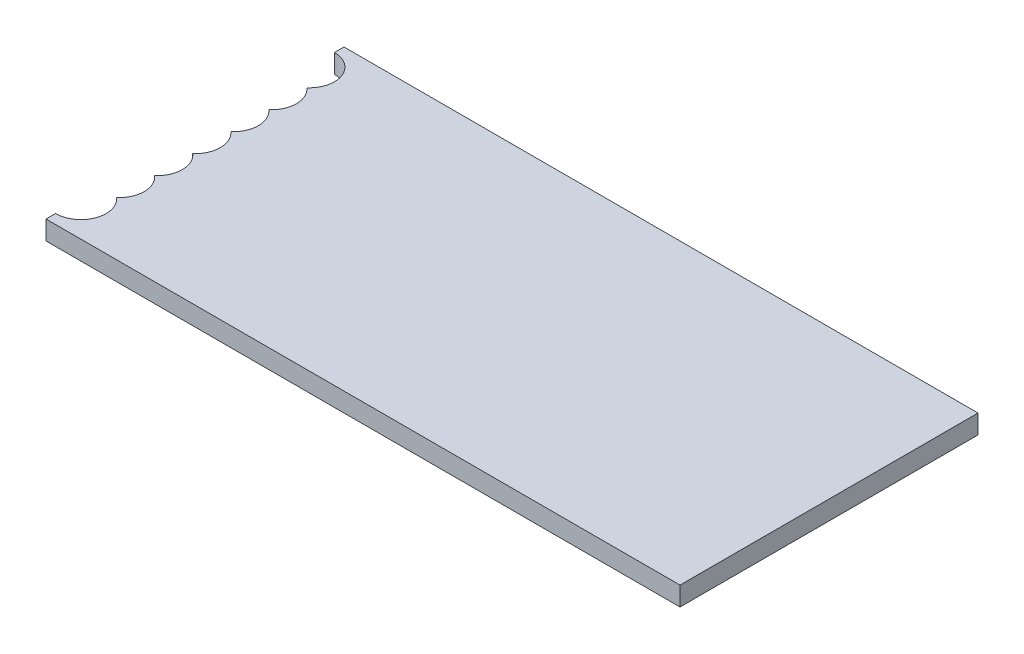
ISO-10303-21;
HEADER;
FILE_DESCRIPTION(('STEP AP214'),'2;1');
FILE_NAME('part.step','',(''),(''),'','','');
FILE_SCHEMA(('AUTOMOTIVE_DESIGN { 1 0 10303 214 1 1 1 1 }'));
ENDSEC;
DATA;
#1=APPLICATION_CONTEXT('core data for automotive mechanical design processes');
#2=APPLICATION_PROTOCOL_DEFINITION('international standard','automotive_design',2000,#1);
#3=PRODUCT_CONTEXT('',#1,'mechanical');
#4=PRODUCT('Part','Part','',(#3));
#5=PRODUCT_RELATED_PRODUCT_CATEGORY('part','',(#4));
#6=PRODUCT_DEFINITION_FORMATION('','',#4);
#7=PRODUCT_DEFINITION_CONTEXT('part definition',#1,'design');
#8=PRODUCT_DEFINITION('design','',#6,#7);
#9=PRODUCT_DEFINITION_SHAPE('','',#8);
#10=(LENGTH_UNIT() NAMED_UNIT(*) SI_UNIT(.MILLI.,.METRE.));
#11=(NAMED_UNIT(*) PLANE_ANGLE_UNIT() SI_UNIT($,.RADIAN.));
#12=(NAMED_UNIT(*) SI_UNIT($,.STERADIAN.) SOLID_ANGLE_UNIT());
#13=UNCERTAINTY_MEASURE_WITH_UNIT(LENGTH_MEASURE(1.E-05),#10,'distance_accuracy_value','');
#14=(GEOMETRIC_REPRESENTATION_CONTEXT(3) GLOBAL_UNCERTAINTY_ASSIGNED_CONTEXT((#13)) GLOBAL_UNIT_ASSIGNED_CONTEXT((#10,
#11,#12)) REPRESENTATION_CONTEXT('',''));
#15=CARTESIAN_POINT('',(0.,0.,0.));
#16=DIRECTION('',(0.,0.,1.));
#17=DIRECTION('',(1.,0.,0.));
#18=AXIS2_PLACEMENT_3D('',#15,#16,#17);
#19=CARTESIAN_POINT('',(-25.,1.5,11.75));
#20=DIRECTION('',(1.,0.,0.));
#21=DIRECTION('',(0.,0.,-1.));
#22=AXIS2_PLACEMENT_3D('',#19,#20,#21);
#23=PLANE('',#22);
#24=DIRECTION('',(0.,0.,1.));
#25=VECTOR('',#24,1.);
#26=CARTESIAN_POINT('',(-25.,0.,11.75));
#27=LINE('',#26,#25);
#28=CARTESIAN_POINT('',(-25.,0.,-11.75));
#29=VERTEX_POINT('',#28);
#30=CARTESIAN_POINT('',(-25.,0.,-11.));
#31=VERTEX_POINT('',#30);
#32=EDGE_CURVE('E159',#29,#31,#27,.T.);
#33=ORIENTED_EDGE('',*,*,#32,.T.);
#34=DIRECTION('',(0.,1.,0.));
#35=VECTOR('',#34,1.);
#36=CARTESIAN_POINT('',(-25.,0.,-11.));
#37=LINE('',#36,#35);
#38=CARTESIAN_POINT('',(-25.,1.5,-11.));
#39=VERTEX_POINT('',#38);
#40=EDGE_CURVE('E208',#31,#39,#37,.T.);
#41=ORIENTED_EDGE('',*,*,#40,.T.);
#42=DIRECTION('',(0.,0.,1.));
#43=VECTOR('',#42,1.);
#44=CARTESIAN_POINT('',(-25.,1.5,11.75));
#45=LINE('',#44,#43);
#46=CARTESIAN_POINT('',(-25.,1.5,-11.75));
#47=VERTEX_POINT('',#46);
#48=EDGE_CURVE('E178',#47,#39,#45,.T.);
#49=ORIENTED_EDGE('',*,*,#48,.F.);
#50=DIRECTION('',(0.,-1.,0.));
#51=VECTOR('',#50,1.);
#52=CARTESIAN_POINT('',(-25.,1.5,-11.75));
#53=LINE('',#52,#51);
#54=EDGE_CURVE('E48',#47,#29,#53,.T.);
#55=ORIENTED_EDGE('',*,*,#54,.T.);
#56=EDGE_LOOP('',(#33,#41,#49,#55));
#57=FACE_BOUND('',#56,.T.);
#58=ADVANCED_FACE('F40',(#57),#23,.F.);
#59=CARTESIAN_POINT('',(25.,1.5,11.75));
#60=DIRECTION('',(-1.,0.,0.));
#61=DIRECTION('',(0.,0.,1.));
#62=AXIS2_PLACEMENT_3D('',#59,#60,#61);
#63=PLANE('',#62);
#64=DIRECTION('',(0.,0.,-1.));
#65=VECTOR('',#64,1.);
#66=CARTESIAN_POINT('',(25.,0.,11.75));
#67=LINE('',#66,#65);
#68=CARTESIAN_POINT('',(25.,0.,11.75));
#69=VERTEX_POINT('',#68);
#70=CARTESIAN_POINT('',(25.,0.,-11.75));
#71=VERTEX_POINT('',#70);
#72=EDGE_CURVE('E163',#69,#71,#67,.T.);
#73=ORIENTED_EDGE('',*,*,#72,.T.);
#74=DIRECTION('',(0.,-1.,0.));
#75=VECTOR('',#74,1.);
#76=CARTESIAN_POINT('',(25.,1.5,-11.75));
#77=LINE('',#76,#75);
#78=CARTESIAN_POINT('',(25.,1.5,-11.75));
#79=VERTEX_POINT('',#78);
#80=EDGE_CURVE('E11',#79,#71,#77,.T.);
#81=ORIENTED_EDGE('',*,*,#80,.F.);
#82=DIRECTION('',(0.,0.,-1.));
#83=VECTOR('',#82,1.);
#84=CARTESIAN_POINT('',(25.,1.5,11.75));
#85=LINE('',#84,#83);
#86=CARTESIAN_POINT('',(25.,1.5,11.75));
#87=VERTEX_POINT('',#86);
#88=EDGE_CURVE('E168',#87,#79,#85,.T.);
#89=ORIENTED_EDGE('',*,*,#88,.F.);
#90=DIRECTION('',(0.,-1.,0.));
#91=VECTOR('',#90,1.);
#92=CARTESIAN_POINT('',(25.,1.5,11.75));
#93=LINE('',#92,#91);
#94=EDGE_CURVE('E169',#87,#69,#93,.T.);
#95=ORIENTED_EDGE('',*,*,#94,.T.);
#96=EDGE_LOOP('',(#73,#81,#89,#95));
#97=FACE_BOUND('',#96,.T.);
#98=ADVANCED_FACE('F42',(#97),#63,.F.);
#99=CARTESIAN_POINT('',(-25.,1.5,-11.75));
#100=DIRECTION('',(0.,0.,1.));
#101=DIRECTION('',(1.,0.,0.));
#102=AXIS2_PLACEMENT_3D('',#99,#100,#101);
#103=PLANE('',#102);
#104=DIRECTION('',(-1.,0.,0.));
#105=VECTOR('',#104,1.);
#106=CARTESIAN_POINT('',(-25.,0.,-11.75));
#107=LINE('',#106,#105);
#108=EDGE_CURVE('E160',#71,#29,#107,.T.);
#109=ORIENTED_EDGE('',*,*,#108,.T.);
#110=ORIENTED_EDGE('',*,*,#54,.F.);
#111=DIRECTION('',(-1.,0.,0.));
#112=VECTOR('',#111,1.);
#113=CARTESIAN_POINT('',(-25.,1.5,-11.75));
#114=LINE('',#113,#112);
#115=EDGE_CURVE('E92',#79,#47,#114,.T.);
#116=ORIENTED_EDGE('',*,*,#115,.F.);
#117=ORIENTED_EDGE('',*,*,#80,.T.);
#118=EDGE_LOOP('',(#109,#110,#116,#117));
#119=FACE_BOUND('',#118,.T.);
#120=ADVANCED_FACE('F239',(#119),#103,.F.);
#121=CARTESIAN_POINT('',(-25.,1.5,11.));
#122=VERTEX_POINT('',#121);
#123=CARTESIAN_POINT('',(-25.,1.5,11.75));
#124=VERTEX_POINT('',#123);
#125=EDGE_CURVE('E153',#122,#124,#45,.T.);
#126=ORIENTED_EDGE('',*,*,#125,.F.);
#127=DIRECTION('',(0.,1.,0.));
#128=VECTOR('',#127,1.);
#129=CARTESIAN_POINT('',(-25.,0.,11.));
#130=LINE('',#129,#128);
#131=CARTESIAN_POINT('',(-25.,0.,11.));
#132=VERTEX_POINT('',#131);
#133=EDGE_CURVE('E141',#132,#122,#130,.T.);
#134=ORIENTED_EDGE('',*,*,#133,.F.);
#135=CARTESIAN_POINT('',(-25.,0.,11.75));
#136=VERTEX_POINT('',#135);
#137=EDGE_CURVE('E152',#132,#136,#27,.T.);
#138=ORIENTED_EDGE('',*,*,#137,.T.);
#139=DIRECTION('',(0.,-1.,0.));
#140=VECTOR('',#139,1.);
#141=CARTESIAN_POINT('',(-25.,1.5,11.75));
#142=LINE('',#141,#140);
#143=EDGE_CURVE('E171',#124,#136,#142,.T.);
#144=ORIENTED_EDGE('',*,*,#143,.F.);
#145=EDGE_LOOP('',(#126,#134,#138,#144));
#146=FACE_BOUND('',#145,.T.);
#147=ADVANCED_FACE('F150',(#146),#23,.F.);
#148=CARTESIAN_POINT('',(-25.,1.5,11.75));
#149=DIRECTION('',(0.,0.,-1.));
#150=DIRECTION('',(-1.,0.,0.));
#151=AXIS2_PLACEMENT_3D('',#148,#149,#150);
#152=PLANE('',#151);
#153=DIRECTION('',(1.,0.,0.));
#154=VECTOR('',#153,1.);
#155=CARTESIAN_POINT('',(-25.,0.,11.75));
#156=LINE('',#155,#154);
#157=EDGE_CURVE('E85',#136,#69,#156,.T.);
#158=ORIENTED_EDGE('',*,*,#157,.T.);
#159=ORIENTED_EDGE('',*,*,#94,.F.);
#160=DIRECTION('',(1.,0.,0.));
#161=VECTOR('',#160,1.);
#162=CARTESIAN_POINT('',(-25.,1.5,11.75));
#163=LINE('',#162,#161);
#164=EDGE_CURVE('E64',#124,#87,#163,.T.);
#165=ORIENTED_EDGE('',*,*,#164,.F.);
#166=ORIENTED_EDGE('',*,*,#143,.T.);
#167=EDGE_LOOP('',(#158,#159,#165,#166));
#168=FACE_BOUND('',#167,.T.);
#169=ADVANCED_FACE('F228',(#168),#152,.F.);
#170=CARTESIAN_POINT('',(0.,1.5,0.));
#171=DIRECTION('',(0.,-1.,0.));
#172=DIRECTION('',(0.,0.,-1.));
#173=AXIS2_PLACEMENT_3D('',#170,#171,#172);
#174=PLANE('',#173);
#175=ORIENTED_EDGE('',*,*,#48,.T.);
#176=CARTESIAN_POINT('',(-25.,1.5,-9.));
#177=DIRECTION('',(0.,1.,0.));
#178=DIRECTION('',(0.,0.,1.));
#179=AXIS2_PLACEMENT_3D('',#176,#177,#178);
#180=CIRCLE('',#179,2.);
#181=CARTESIAN_POINT('',(-23.6771243444677,1.5,-7.5));
#182=VERTEX_POINT('',#181);
#183=EDGE_CURVE('E146',#182,#39,#180,.T.);
#184=ORIENTED_EDGE('',*,*,#183,.F.);
#185=CARTESIAN_POINT('',(-25.,1.5,-6.));
#186=DIRECTION('',(0.,1.,0.));
#187=DIRECTION('',(0.,0.,1.));
#188=AXIS2_PLACEMENT_3D('',#185,#186,#187);
#189=CIRCLE('',#188,2.);
#190=CARTESIAN_POINT('',(-23.6771243444677,1.5,-4.5));
#191=VERTEX_POINT('',#190);
#192=EDGE_CURVE('E204',#191,#182,#189,.T.);
#193=ORIENTED_EDGE('',*,*,#192,.F.);
#194=CARTESIAN_POINT('',(-25.,1.5,-3.));
#195=DIRECTION('',(0.,1.,0.));
#196=DIRECTION('',(0.,0.,1.));
#197=AXIS2_PLACEMENT_3D('',#194,#195,#196);
#198=CIRCLE('',#197,2.);
#199=CARTESIAN_POINT('',(-23.6771243444677,1.5,-1.50000000000001));
#200=VERTEX_POINT('',#199);
#201=EDGE_CURVE('E201',#200,#191,#198,.T.);
#202=ORIENTED_EDGE('',*,*,#201,.F.);
#203=CARTESIAN_POINT('',(-25.,1.5,0.));
#204=DIRECTION('',(0.,1.,0.));
#205=DIRECTION('',(0.,0.,1.));
#206=AXIS2_PLACEMENT_3D('',#203,#204,#205);
#207=CIRCLE('',#206,2.);
#208=CARTESIAN_POINT('',(-23.6771243444677,1.5,1.5));
#209=VERTEX_POINT('',#208);
#210=EDGE_CURVE('E198',#209,#200,#207,.T.);
#211=ORIENTED_EDGE('',*,*,#210,.F.);
#212=CARTESIAN_POINT('',(-25.,1.5,3.));
#213=DIRECTION('',(0.,1.,0.));
#214=DIRECTION('',(0.,0.,1.));
#215=AXIS2_PLACEMENT_3D('',#212,#213,#214);
#216=CIRCLE('',#215,2.);
#217=CARTESIAN_POINT('',(-23.6771243444677,1.5,4.5));
#218=VERTEX_POINT('',#217);
#219=EDGE_CURVE('E195',#218,#209,#216,.T.);
#220=ORIENTED_EDGE('',*,*,#219,.F.);
#221=CARTESIAN_POINT('',(-25.,1.5,6.));
#222=DIRECTION('',(0.,1.,0.));
#223=DIRECTION('',(0.,0.,1.));
#224=AXIS2_PLACEMENT_3D('',#221,#222,#223);
#225=CIRCLE('',#224,2.);
#226=CARTESIAN_POINT('',(-23.6771243444677,1.5,7.5));
#227=VERTEX_POINT('',#226);
#228=EDGE_CURVE('E192',#227,#218,#225,.T.);
#229=ORIENTED_EDGE('',*,*,#228,.F.);
#230=CARTESIAN_POINT('',(-25.,1.5,9.));
#231=DIRECTION('',(0.,1.,0.));
#232=DIRECTION('',(0.,0.,1.));
#233=AXIS2_PLACEMENT_3D('',#230,#231,#232);
#234=CIRCLE('',#233,2.);
#235=EDGE_CURVE('E190',#122,#227,#234,.T.);
#236=ORIENTED_EDGE('',*,*,#235,.F.);
#237=ORIENTED_EDGE('',*,*,#125,.T.);
#238=ORIENTED_EDGE('',*,*,#164,.T.);
#239=ORIENTED_EDGE('',*,*,#88,.T.);
#240=ORIENTED_EDGE('',*,*,#115,.T.);
#241=EDGE_LOOP('',(#175,#184,#193,#202,#211,#220,#229,#236,#237,#238,#239,#240));
#242=FACE_BOUND('',#241,.T.);
#243=ADVANCED_FACE('F230',(#242),#174,.F.);
#244=CARTESIAN_POINT('',(0.,0.,0.));
#245=DIRECTION('',(0.,-1.,0.));
#246=DIRECTION('',(0.,0.,-1.));
#247=AXIS2_PLACEMENT_3D('',#244,#245,#246);
#248=PLANE('',#247);
#249=CARTESIAN_POINT('',(-25.,0.,-9.));
#250=DIRECTION('',(0.,1.,0.));
#251=DIRECTION('',(0.,0.,1.));
#252=AXIS2_PLACEMENT_3D('',#249,#250,#251);
#253=CIRCLE('',#252,2.);
#254=CARTESIAN_POINT('',(-23.6771243444677,0.,-7.5));
#255=VERTEX_POINT('',#254);
#256=EDGE_CURVE('E154',#255,#31,#253,.T.);
#257=ORIENTED_EDGE('',*,*,#256,.T.);
#258=ORIENTED_EDGE('',*,*,#32,.F.);
#259=ORIENTED_EDGE('',*,*,#108,.F.);
#260=ORIENTED_EDGE('',*,*,#72,.F.);
#261=ORIENTED_EDGE('',*,*,#157,.F.);
#262=ORIENTED_EDGE('',*,*,#137,.F.);
#263=CARTESIAN_POINT('',(-25.,0.,9.));
#264=DIRECTION('',(0.,1.,0.));
#265=DIRECTION('',(0.,0.,1.));
#266=AXIS2_PLACEMENT_3D('',#263,#264,#265);
#267=CIRCLE('',#266,2.);
#268=CARTESIAN_POINT('',(-23.6771243444677,0.,7.5));
#269=VERTEX_POINT('',#268);
#270=EDGE_CURVE('E137',#132,#269,#267,.T.);
#271=ORIENTED_EDGE('',*,*,#270,.T.);
#272=CARTESIAN_POINT('',(-25.,0.,6.));
#273=DIRECTION('',(0.,1.,0.));
#274=DIRECTION('',(0.,0.,1.));
#275=AXIS2_PLACEMENT_3D('',#272,#273,#274);
#276=CIRCLE('',#275,2.);
#277=CARTESIAN_POINT('',(-23.6771243444677,0.,4.5));
#278=VERTEX_POINT('',#277);
#279=EDGE_CURVE('E55',#269,#278,#276,.T.);
#280=ORIENTED_EDGE('',*,*,#279,.T.);
#281=CARTESIAN_POINT('',(-25.,0.,3.));
#282=DIRECTION('',(0.,1.,0.));
#283=DIRECTION('',(0.,0.,1.));
#284=AXIS2_PLACEMENT_3D('',#281,#282,#283);
#285=CIRCLE('',#284,2.);
#286=CARTESIAN_POINT('',(-23.6771243444677,0.,1.5));
#287=VERTEX_POINT('',#286);
#288=EDGE_CURVE('E384',#278,#287,#285,.T.);
#289=ORIENTED_EDGE('',*,*,#288,.T.);
#290=CARTESIAN_POINT('',(-25.,0.,0.));
#291=DIRECTION('',(0.,1.,0.));
#292=DIRECTION('',(0.,0.,1.));
#293=AXIS2_PLACEMENT_3D('',#290,#291,#292);
#294=CIRCLE('',#293,2.);
#295=CARTESIAN_POINT('',(-23.6771243444677,0.,-1.50000000000001));
#296=VERTEX_POINT('',#295);
#297=EDGE_CURVE('E386',#287,#296,#294,.T.);
#298=ORIENTED_EDGE('',*,*,#297,.T.);
#299=CARTESIAN_POINT('',(-25.,0.,-3.));
#300=DIRECTION('',(0.,1.,0.));
#301=DIRECTION('',(0.,0.,1.));
#302=AXIS2_PLACEMENT_3D('',#299,#300,#301);
#303=CIRCLE('',#302,2.);
#304=CARTESIAN_POINT('',(-23.6771243444677,0.,-4.5));
#305=VERTEX_POINT('',#304);
#306=EDGE_CURVE('E186',#296,#305,#303,.T.);
#307=ORIENTED_EDGE('',*,*,#306,.T.);
#308=CARTESIAN_POINT('',(-25.,0.,-6.));
#309=DIRECTION('',(0.,1.,0.));
#310=DIRECTION('',(0.,0.,1.));
#311=AXIS2_PLACEMENT_3D('',#308,#309,#310);
#312=CIRCLE('',#311,2.);
#313=EDGE_CURVE('E183',#305,#255,#312,.T.);
#314=ORIENTED_EDGE('',*,*,#313,.T.);
#315=EDGE_LOOP('',(#257,#258,#259,#260,#261,#262,#271,#280,#289,#298,#307,#314));
#316=FACE_BOUND('',#315,.T.);
#317=ADVANCED_FACE('F157',(#316),#248,.T.);
#318=CARTESIAN_POINT('',(-25.,0.,-9.));
#319=DIRECTION('',(0.,1.,0.));
#320=DIRECTION('',(0.,0.,1.));
#321=AXIS2_PLACEMENT_3D('',#318,#319,#320);
#322=CYLINDRICAL_SURFACE('',#321,2.);
#323=ORIENTED_EDGE('',*,*,#183,.T.);
#324=ORIENTED_EDGE('',*,*,#40,.F.);
#325=ORIENTED_EDGE('',*,*,#256,.F.);
#326=DIRECTION('',(0.,1.,0.));
#327=VECTOR('',#326,1.);
#328=CARTESIAN_POINT('',(-23.6771243444677,0.,-7.5));
#329=LINE('',#328,#327);
#330=EDGE_CURVE('E210',#255,#182,#329,.T.);
#331=ORIENTED_EDGE('',*,*,#330,.T.);
#332=EDGE_LOOP('',(#323,#324,#325,#331));
#333=FACE_BOUND('',#332,.T.);
#334=ADVANCED_FACE('F275',(#333),#322,.F.);
#335=CARTESIAN_POINT('',(-25.,0.,-6.));
#336=DIRECTION('',(0.,1.,0.));
#337=DIRECTION('',(0.,0.,1.));
#338=AXIS2_PLACEMENT_3D('',#335,#336,#337);
#339=CYLINDRICAL_SURFACE('',#338,2.);
#340=ORIENTED_EDGE('',*,*,#192,.T.);
#341=ORIENTED_EDGE('',*,*,#330,.F.);
#342=ORIENTED_EDGE('',*,*,#313,.F.);
#343=DIRECTION('',(0.,1.,0.));
#344=VECTOR('',#343,1.);
#345=CARTESIAN_POINT('',(-23.6771243444677,0.,-4.5));
#346=LINE('',#345,#344);
#347=EDGE_CURVE('E212',#305,#191,#346,.T.);
#348=ORIENTED_EDGE('',*,*,#347,.T.);
#349=EDGE_LOOP('',(#340,#341,#342,#348));
#350=FACE_BOUND('',#349,.T.);
#351=ADVANCED_FACE('F287',(#350),#339,.F.);
#352=CARTESIAN_POINT('',(-25.,0.,-3.));
#353=DIRECTION('',(0.,1.,0.));
#354=DIRECTION('',(0.,0.,1.));
#355=AXIS2_PLACEMENT_3D('',#352,#353,#354);
#356=CYLINDRICAL_SURFACE('',#355,2.);
#357=ORIENTED_EDGE('',*,*,#201,.T.);
#358=ORIENTED_EDGE('',*,*,#347,.F.);
#359=ORIENTED_EDGE('',*,*,#306,.F.);
#360=DIRECTION('',(0.,1.,0.));
#361=VECTOR('',#360,1.);
#362=CARTESIAN_POINT('',(-23.6771243444677,0.,-1.50000000000001));
#363=LINE('',#362,#361);
#364=EDGE_CURVE('E214',#296,#200,#363,.T.);
#365=ORIENTED_EDGE('',*,*,#364,.T.);
#366=EDGE_LOOP('',(#357,#358,#359,#365));
#367=FACE_BOUND('',#366,.T.);
#368=ADVANCED_FACE('F295',(#367),#356,.F.);
#369=CARTESIAN_POINT('',(-25.,0.,0.));
#370=DIRECTION('',(0.,1.,0.));
#371=DIRECTION('',(0.,0.,1.));
#372=AXIS2_PLACEMENT_3D('',#369,#370,#371);
#373=CYLINDRICAL_SURFACE('',#372,2.);
#374=ORIENTED_EDGE('',*,*,#210,.T.);
#375=ORIENTED_EDGE('',*,*,#364,.F.);
#376=ORIENTED_EDGE('',*,*,#297,.F.);
#377=DIRECTION('',(0.,1.,0.));
#378=VECTOR('',#377,1.);
#379=CARTESIAN_POINT('',(-23.6771243444677,0.,1.5));
#380=LINE('',#379,#378);
#381=EDGE_CURVE('E216',#287,#209,#380,.T.);
#382=ORIENTED_EDGE('',*,*,#381,.T.);
#383=EDGE_LOOP('',(#374,#375,#376,#382));
#384=FACE_BOUND('',#383,.T.);
#385=ADVANCED_FACE('F305',(#384),#373,.F.);
#386=CARTESIAN_POINT('',(-25.,0.,3.));
#387=DIRECTION('',(0.,1.,0.));
#388=DIRECTION('',(0.,0.,1.));
#389=AXIS2_PLACEMENT_3D('',#386,#387,#388);
#390=CYLINDRICAL_SURFACE('',#389,2.);
#391=ORIENTED_EDGE('',*,*,#219,.T.);
#392=ORIENTED_EDGE('',*,*,#381,.F.);
#393=ORIENTED_EDGE('',*,*,#288,.F.);
#394=DIRECTION('',(0.,1.,0.));
#395=VECTOR('',#394,1.);
#396=CARTESIAN_POINT('',(-23.6771243444677,0.,4.5));
#397=LINE('',#396,#395);
#398=EDGE_CURVE('E218',#278,#218,#397,.T.);
#399=ORIENTED_EDGE('',*,*,#398,.T.);
#400=EDGE_LOOP('',(#391,#392,#393,#399));
#401=FACE_BOUND('',#400,.T.);
#402=ADVANCED_FACE('F315',(#401),#390,.F.);
#403=CARTESIAN_POINT('',(-25.,0.,6.));
#404=DIRECTION('',(0.,1.,0.));
#405=DIRECTION('',(0.,0.,1.));
#406=AXIS2_PLACEMENT_3D('',#403,#404,#405);
#407=CYLINDRICAL_SURFACE('',#406,2.);
#408=ORIENTED_EDGE('',*,*,#228,.T.);
#409=ORIENTED_EDGE('',*,*,#398,.F.);
#410=ORIENTED_EDGE('',*,*,#279,.F.);
#411=DIRECTION('',(0.,1.,0.));
#412=VECTOR('',#411,1.);
#413=CARTESIAN_POINT('',(-23.6771243444677,0.,7.5));
#414=LINE('',#413,#412);
#415=EDGE_CURVE('E143',#269,#227,#414,.T.);
#416=ORIENTED_EDGE('',*,*,#415,.T.);
#417=EDGE_LOOP('',(#408,#409,#410,#416));
#418=FACE_BOUND('',#417,.T.);
#419=ADVANCED_FACE('F326',(#418),#407,.F.);
#420=CARTESIAN_POINT('',(-25.,0.,9.));
#421=DIRECTION('',(0.,1.,0.));
#422=DIRECTION('',(0.,0.,1.));
#423=AXIS2_PLACEMENT_3D('',#420,#421,#422);
#424=CYLINDRICAL_SURFACE('',#423,2.);
#425=ORIENTED_EDGE('',*,*,#235,.T.);
#426=ORIENTED_EDGE('',*,*,#415,.F.);
#427=ORIENTED_EDGE('',*,*,#270,.F.);
#428=ORIENTED_EDGE('',*,*,#133,.T.);
#429=EDGE_LOOP('',(#425,#426,#427,#428));
#430=FACE_BOUND('',#429,.T.);
#431=ADVANCED_FACE('F140',(#430),#424,.F.);
#432=CLOSED_SHELL('',(#58,#98,#120,#147,#169,#243,#317,#334,#351,#368,#385,#402,#419,#431));
#433=MANIFOLD_SOLID_BREP('B2',#432);
#434=ADVANCED_BREP_SHAPE_REPRESENTATION('',(#18,#433),#14);
#435=SHAPE_DEFINITION_REPRESENTATION(#9,#434);
ENDSEC;
END-ISO-10303-21;
